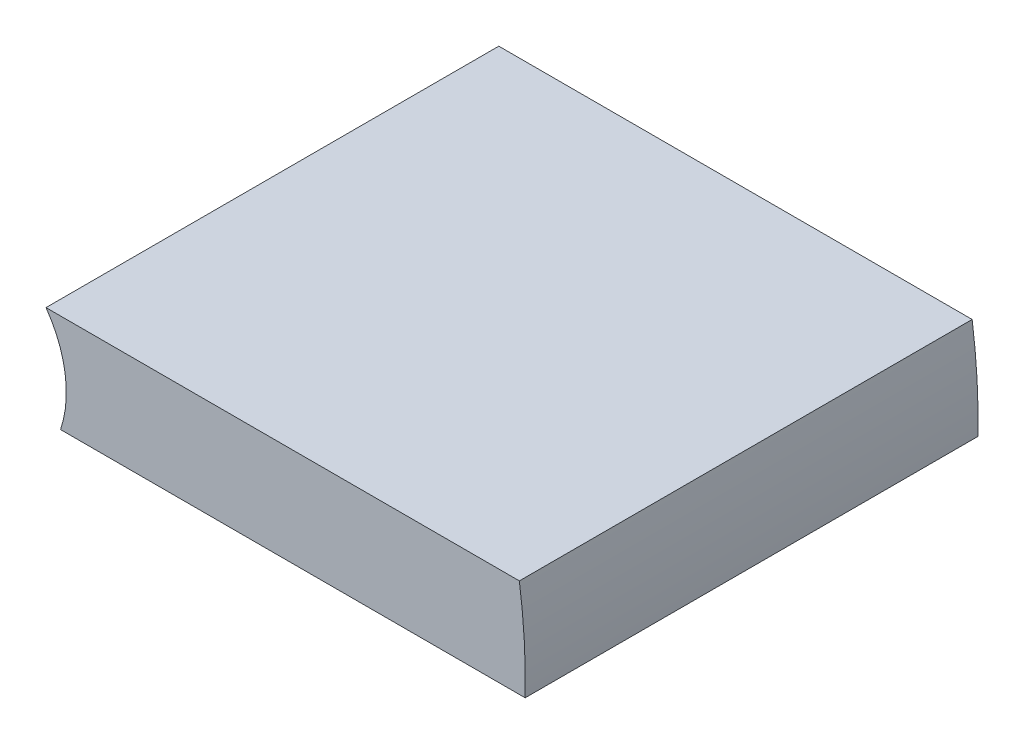
ISO-10303-21;
HEADER;
FILE_DESCRIPTION(('STEP AP214'),'2;1');
FILE_NAME('part.step','',(''),(''),'','','');
FILE_SCHEMA(('AUTOMOTIVE_DESIGN { 1 0 10303 214 1 1 1 1 }'));
ENDSEC;
DATA;
#1=APPLICATION_CONTEXT('core data for automotive mechanical design processes');
#2=APPLICATION_PROTOCOL_DEFINITION('international standard','automotive_design',2000,#1);
#3=PRODUCT_CONTEXT('',#1,'mechanical');
#4=PRODUCT('Part','Part','',(#3));
#5=PRODUCT_RELATED_PRODUCT_CATEGORY('part','',(#4));
#6=PRODUCT_DEFINITION_FORMATION('','',#4);
#7=PRODUCT_DEFINITION_CONTEXT('part definition',#1,'design');
#8=PRODUCT_DEFINITION('design','',#6,#7);
#9=PRODUCT_DEFINITION_SHAPE('','',#8);
#10=(LENGTH_UNIT() NAMED_UNIT(*) SI_UNIT(.MILLI.,.METRE.));
#11=(NAMED_UNIT(*) PLANE_ANGLE_UNIT() SI_UNIT($,.RADIAN.));
#12=(NAMED_UNIT(*) SI_UNIT($,.STERADIAN.) SOLID_ANGLE_UNIT());
#13=UNCERTAINTY_MEASURE_WITH_UNIT(LENGTH_MEASURE(1.E-05),#10,'distance_accuracy_value','');
#14=(GEOMETRIC_REPRESENTATION_CONTEXT(3) GLOBAL_UNCERTAINTY_ASSIGNED_CONTEXT((#13)) GLOBAL_UNIT_ASSIGNED_CONTEXT((#10,
#11,#12)) REPRESENTATION_CONTEXT('',''));
#15=CARTESIAN_POINT('',(0.,0.,0.));
#16=DIRECTION('',(0.,0.,1.));
#17=DIRECTION('',(1.,0.,0.));
#18=AXIS2_PLACEMENT_3D('',#15,#16,#17);
#19=CARTESIAN_POINT('',(-26.443067343184,6.002896226117,0.));
#20=DIRECTION('',(0.,-1.,0.));
#21=DIRECTION('',(1.,0.,0.));
#22=AXIS2_PLACEMENT_3D('',#19,#20,#21);
#23=PLANE('',#22);
#24=DIRECTION('',(1.,0.,0.));
#25=VECTOR('',#24,1.);
#26=CARTESIAN_POINT('',(-26.443067343184,6.002896226117,0.));
#27=LINE('',#26,#25);
#28=CARTESIAN_POINT('',(-26.443067343184,6.002896226117,0.));
#29=VERTEX_POINT('',#28);
#30=CARTESIAN_POINT('',(-26.3404523564,6.002896226117,0.));
#31=VERTEX_POINT('',#30);
#32=EDGE_CURVE('E11',#29,#31,#27,.T.);
#33=ORIENTED_EDGE('',*,*,#32,.T.);
#34=DIRECTION('',(0.,0.,1.));
#35=VECTOR('',#34,1.);
#36=CARTESIAN_POINT('',(-26.3404523564,6.002896226117,0.));
#37=LINE('',#36,#35);
#38=CARTESIAN_POINT('',(-26.3404523564,6.002896226117,0.1));
#39=VERTEX_POINT('',#38);
#40=EDGE_CURVE('E24',#31,#39,#37,.T.);
#41=ORIENTED_EDGE('',*,*,#40,.T.);
#42=DIRECTION('',(1.,0.,0.));
#43=VECTOR('',#42,1.);
#44=CARTESIAN_POINT('',(-26.443067343184,6.002896226117,0.1));
#45=LINE('',#44,#43);
#46=CARTESIAN_POINT('',(-26.443067343184,6.002896226117,0.1));
#47=VERTEX_POINT('',#46);
#48=EDGE_CURVE('E75',#47,#39,#45,.T.);
#49=ORIENTED_EDGE('',*,*,#48,.F.);
#50=DIRECTION('',(0.,0.,1.));
#51=VECTOR('',#50,1.);
#52=CARTESIAN_POINT('',(-26.443067343184,6.002896226117,0.));
#53=LINE('',#52,#51);
#54=EDGE_CURVE('E86',#29,#47,#53,.T.);
#55=ORIENTED_EDGE('',*,*,#54,.F.);
#56=EDGE_LOOP('',(#33,#41,#49,#55));
#57=FACE_BOUND('',#56,.T.);
#58=ADVANCED_FACE('F17',(#57),#23,.T.);
#59=CARTESIAN_POINT('',(-26.465894012057,6.010624532242,0.));
#60=DIRECTION('',(0.,0.,1.));
#61=DIRECTION('',(-0.947186269566776,0.320683910953097,0.));
#62=AXIS2_PLACEMENT_3D('',#59,#60,#61);
#63=CYLINDRICAL_SURFACE('',#62,0.02409945076979);
#64=CARTESIAN_POINT('',(-26.465894012057,6.010624532242,0.));
#65=DIRECTION('',(0.,0.,-1.));
#66=DIRECTION('',(-0.947186269566776,0.320683910953097,0.));
#67=AXIS2_PLACEMENT_3D('',#64,#65,#66);
#68=CIRCLE('',#67,0.02409945076979);
#69=CARTESIAN_POINT('',(-26.446278705077,6.024625362914,0.));
#70=VERTEX_POINT('',#69);
#71=EDGE_CURVE('E83',#70,#29,#68,.T.);
#72=ORIENTED_EDGE('',*,*,#71,.T.);
#73=ORIENTED_EDGE('',*,*,#54,.T.);
#74=CARTESIAN_POINT('',(-26.465894012057,6.010624532242,0.1));
#75=DIRECTION('',(0.,0.,-1.));
#76=DIRECTION('',(-0.947186269566776,0.320683910953097,0.));
#77=AXIS2_PLACEMENT_3D('',#74,#75,#76);
#78=CIRCLE('',#77,0.02409945076979);
#79=CARTESIAN_POINT('',(-26.446278705077,6.024625362914,0.1));
#80=VERTEX_POINT('',#79);
#81=EDGE_CURVE('E81',#80,#47,#78,.T.);
#82=ORIENTED_EDGE('',*,*,#81,.F.);
#83=DIRECTION('',(0.,0.,1.));
#84=VECTOR('',#83,1.);
#85=CARTESIAN_POINT('',(-26.446278705077,6.024625362914,0.));
#86=LINE('',#85,#84);
#87=EDGE_CURVE('E60',#70,#80,#86,.T.);
#88=ORIENTED_EDGE('',*,*,#87,.F.);
#89=EDGE_LOOP('',(#72,#73,#82,#88));
#90=FACE_BOUND('',#89,.T.);
#91=ADVANCED_FACE('F91',(#90),#63,.F.);
#92=CARTESIAN_POINT('',(-26.341735328641,6.024625362914,0.));
#93=DIRECTION('',(0.,1.,0.));
#94=DIRECTION('',(-1.,0.,0.));
#95=AXIS2_PLACEMENT_3D('',#92,#93,#94);
#96=PLANE('',#95);
#97=DIRECTION('',(-1.,0.,0.));
#98=VECTOR('',#97,1.);
#99=CARTESIAN_POINT('',(-26.341735328641,6.024625362914,0.));
#100=LINE('',#99,#98);
#101=CARTESIAN_POINT('',(-26.341735328641,6.024625362914,0.));
#102=VERTEX_POINT('',#101);
#103=EDGE_CURVE('E65',#102,#70,#100,.T.);
#104=ORIENTED_EDGE('',*,*,#103,.T.);
#105=ORIENTED_EDGE('',*,*,#87,.T.);
#106=DIRECTION('',(-1.,0.,0.));
#107=VECTOR('',#106,1.);
#108=CARTESIAN_POINT('',(-26.341735328641,6.024625362914,0.1));
#109=LINE('',#108,#107);
#110=CARTESIAN_POINT('',(-26.341735328641,6.024625362914,0.1));
#111=VERTEX_POINT('',#110);
#112=EDGE_CURVE('E54',#111,#80,#109,.T.);
#113=ORIENTED_EDGE('',*,*,#112,.F.);
#114=DIRECTION('',(0.,0.,1.));
#115=VECTOR('',#114,1.);
#116=CARTESIAN_POINT('',(-26.341735328641,6.024625362914,0.));
#117=LINE('',#116,#115);
#118=EDGE_CURVE('E58',#102,#111,#117,.T.);
#119=ORIENTED_EDGE('',*,*,#118,.F.);
#120=EDGE_LOOP('',(#104,#105,#113,#119));
#121=FACE_BOUND('',#120,.T.);
#122=ADVANCED_FACE('F57',(#121),#96,.T.);
#123=CARTESIAN_POINT('',(-26.474240487687,6.005899301844,0.));
#124=DIRECTION('',(0.,0.,1.));
#125=DIRECTION('',(0.999748172403053,-0.02244085062459,0.));
#126=AXIS2_PLACEMENT_3D('',#123,#124,#125);
#127=CYLINDRICAL_SURFACE('',#126,0.133821831316658);
#128=CARTESIAN_POINT('',(-26.474240487687,6.005899301844,0.));
#129=DIRECTION('',(0.,0.,1.));
#130=DIRECTION('',(0.999748172403053,-0.02244085062459,0.));
#131=AXIS2_PLACEMENT_3D('',#128,#129,#130);
#132=CIRCLE('',#131,0.133821831316658);
#133=EDGE_CURVE('E71',#31,#102,#132,.T.);
#134=ORIENTED_EDGE('',*,*,#133,.T.);
#135=ORIENTED_EDGE('',*,*,#118,.T.);
#136=CARTESIAN_POINT('',(-26.474240487687,6.005899301844,0.1));
#137=DIRECTION('',(0.,0.,1.));
#138=DIRECTION('',(0.999748172403053,-0.02244085062459,0.));
#139=AXIS2_PLACEMENT_3D('',#136,#137,#138);
#140=CIRCLE('',#139,0.133821831316658);
#141=EDGE_CURVE('E70',#39,#111,#140,.T.);
#142=ORIENTED_EDGE('',*,*,#141,.F.);
#143=ORIENTED_EDGE('',*,*,#40,.F.);
#144=EDGE_LOOP('',(#134,#135,#142,#143));
#145=FACE_BOUND('',#144,.T.);
#146=ADVANCED_FACE('F69',(#145),#127,.T.);
#147=CARTESIAN_POINT('',(-26.392912688319,6.013867332932,0.1));
#148=DIRECTION('',(0.,0.,1.));
#149=DIRECTION('',(1.,0.,0.));
#150=AXIS2_PLACEMENT_3D('',#147,#148,#149);
#151=PLANE('',#150);
#152=ORIENTED_EDGE('',*,*,#141,.T.);
#153=ORIENTED_EDGE('',*,*,#112,.T.);
#154=ORIENTED_EDGE('',*,*,#81,.T.);
#155=ORIENTED_EDGE('',*,*,#48,.T.);
#156=EDGE_LOOP('',(#152,#153,#154,#155));
#157=FACE_BOUND('',#156,.T.);
#158=ADVANCED_FACE('F74',(#157),#151,.T.);
#159=CARTESIAN_POINT('',(-26.392912688319,6.013867332932,0.));
#160=DIRECTION('',(0.,0.,1.));
#161=DIRECTION('',(1.,0.,0.));
#162=AXIS2_PLACEMENT_3D('',#159,#160,#161);
#163=PLANE('',#162);
#164=ORIENTED_EDGE('',*,*,#133,.F.);
#165=ORIENTED_EDGE('',*,*,#32,.F.);
#166=ORIENTED_EDGE('',*,*,#71,.F.);
#167=ORIENTED_EDGE('',*,*,#103,.F.);
#168=EDGE_LOOP('',(#164,#165,#166,#167));
#169=FACE_BOUND('',#168,.T.);
#170=ADVANCED_FACE('F89',(#169),#163,.F.);
#171=CLOSED_SHELL('',(#58,#91,#122,#146,#158,#170));
#172=MANIFOLD_SOLID_BREP('B1',#171);
#173=ADVANCED_BREP_SHAPE_REPRESENTATION('',(#18,#172),#14);
#174=SHAPE_DEFINITION_REPRESENTATION(#9,#173);
ENDSEC;
END-ISO-10303-21;
